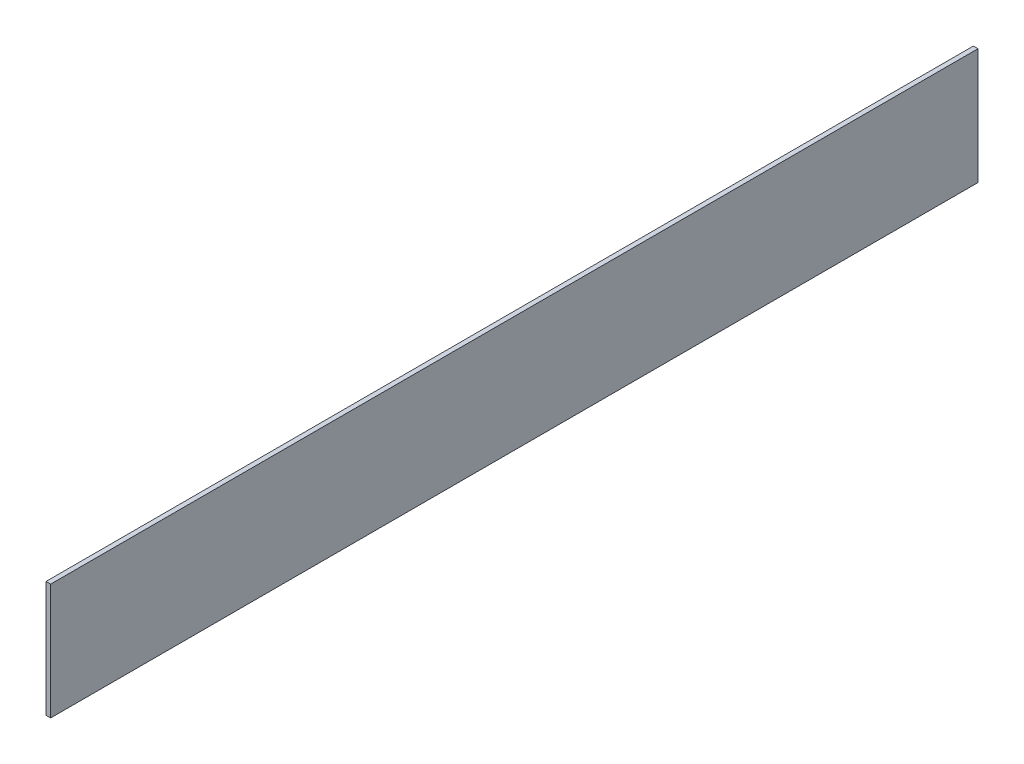
ISO-10303-21;
HEADER;
FILE_DESCRIPTION(('STEP AP214'),'2;1');
FILE_NAME('part.step','',(''),(''),'','','');
FILE_SCHEMA(('AUTOMOTIVE_DESIGN { 1 0 10303 214 1 1 1 1 }'));
ENDSEC;
DATA;
#1=APPLICATION_CONTEXT('core data for automotive mechanical design processes');
#2=APPLICATION_PROTOCOL_DEFINITION('international standard','automotive_design',2000,#1);
#3=PRODUCT_CONTEXT('',#1,'mechanical');
#4=PRODUCT('Part','Part','',(#3));
#5=PRODUCT_RELATED_PRODUCT_CATEGORY('part','',(#4));
#6=PRODUCT_DEFINITION_FORMATION('','',#4);
#7=PRODUCT_DEFINITION_CONTEXT('part definition',#1,'design');
#8=PRODUCT_DEFINITION('design','',#6,#7);
#9=PRODUCT_DEFINITION_SHAPE('','',#8);
#10=(LENGTH_UNIT() NAMED_UNIT(*) SI_UNIT(.MILLI.,.METRE.));
#11=(NAMED_UNIT(*) PLANE_ANGLE_UNIT() SI_UNIT($,.RADIAN.));
#12=(NAMED_UNIT(*) SI_UNIT($,.STERADIAN.) SOLID_ANGLE_UNIT());
#13=UNCERTAINTY_MEASURE_WITH_UNIT(LENGTH_MEASURE(1.E-05),#10,'distance_accuracy_value','');
#14=(GEOMETRIC_REPRESENTATION_CONTEXT(3) GLOBAL_UNCERTAINTY_ASSIGNED_CONTEXT((#13)) GLOBAL_UNIT_ASSIGNED_CONTEXT((#10,
#11,#12)) REPRESENTATION_CONTEXT('',''));
#15=CARTESIAN_POINT('',(0.,0.,0.));
#16=DIRECTION('',(0.,0.,1.));
#17=DIRECTION('',(1.,0.,0.));
#18=AXIS2_PLACEMENT_3D('',#15,#16,#17);
#19=CARTESIAN_POINT('',(318.4,1.6,-320.));
#20=DIRECTION('',(-1.,0.,0.));
#21=DIRECTION('',(0.,0.,1.));
#22=AXIS2_PLACEMENT_3D('',#19,#20,#21);
#23=PLANE('',#22);
#24=DIRECTION('',(0.,-1.,0.));
#25=VECTOR('',#24,1.);
#26=CARTESIAN_POINT('',(318.4,1.6,0.));
#27=LINE('',#26,#25);
#28=CARTESIAN_POINT('',(318.4,41.6,0.));
#29=VERTEX_POINT('',#28);
#30=CARTESIAN_POINT('',(318.4,1.6,0.));
#31=VERTEX_POINT('',#30);
#32=EDGE_CURVE('E103',#29,#31,#27,.T.);
#33=ORIENTED_EDGE('',*,*,#32,.F.);
#34=DIRECTION('',(0.,0.,1.));
#35=VECTOR('',#34,1.);
#36=CARTESIAN_POINT('',(318.4,41.6,-320.));
#37=LINE('',#36,#35);
#38=CARTESIAN_POINT('',(318.4,41.6,-320.));
#39=VERTEX_POINT('',#38);
#40=EDGE_CURVE('E11',#39,#29,#37,.T.);
#41=ORIENTED_EDGE('',*,*,#40,.F.);
#42=DIRECTION('',(0.,-1.,0.));
#43=VECTOR('',#42,1.);
#44=CARTESIAN_POINT('',(318.4,1.6,-320.));
#45=LINE('',#44,#43);
#46=CARTESIAN_POINT('',(318.4,1.6,-320.));
#47=VERTEX_POINT('',#46);
#48=EDGE_CURVE('E97',#39,#47,#45,.T.);
#49=ORIENTED_EDGE('',*,*,#48,.T.);
#50=DIRECTION('',(0.,0.,1.));
#51=VECTOR('',#50,1.);
#52=CARTESIAN_POINT('',(318.4,1.6,-320.));
#53=LINE('',#52,#51);
#54=EDGE_CURVE('E42',#47,#31,#53,.T.);
#55=ORIENTED_EDGE('',*,*,#54,.T.);
#56=EDGE_LOOP('',(#33,#41,#49,#55));
#57=FACE_BOUND('',#56,.T.);
#58=ADVANCED_FACE('F39',(#57),#23,.T.);
#59=CARTESIAN_POINT('',(318.4,41.6,-320.));
#60=DIRECTION('',(0.,1.,0.));
#61=DIRECTION('',(0.,0.,1.));
#62=AXIS2_PLACEMENT_3D('',#59,#60,#61);
#63=PLANE('',#62);
#64=DIRECTION('',(-1.,0.,0.));
#65=VECTOR('',#64,1.);
#66=CARTESIAN_POINT('',(318.4,41.6,0.));
#67=LINE('',#66,#65);
#68=CARTESIAN_POINT('',(320.,41.6,0.));
#69=VERTEX_POINT('',#68);
#70=EDGE_CURVE('E99',#69,#29,#67,.T.);
#71=ORIENTED_EDGE('',*,*,#70,.F.);
#72=DIRECTION('',(0.,0.,1.));
#73=VECTOR('',#72,1.);
#74=CARTESIAN_POINT('',(320.,41.6,-320.));
#75=LINE('',#74,#73);
#76=CARTESIAN_POINT('',(320.,41.6,-320.));
#77=VERTEX_POINT('',#76);
#78=EDGE_CURVE('E48',#77,#69,#75,.T.);
#79=ORIENTED_EDGE('',*,*,#78,.F.);
#80=DIRECTION('',(-1.,0.,0.));
#81=VECTOR('',#80,1.);
#82=CARTESIAN_POINT('',(318.4,41.6,-320.));
#83=LINE('',#82,#81);
#84=EDGE_CURVE('E94',#77,#39,#83,.T.);
#85=ORIENTED_EDGE('',*,*,#84,.T.);
#86=ORIENTED_EDGE('',*,*,#40,.T.);
#87=EDGE_LOOP('',(#71,#79,#85,#86));
#88=FACE_BOUND('',#87,.T.);
#89=ADVANCED_FACE('F113',(#88),#63,.T.);
#90=CARTESIAN_POINT('',(320.,1.6,-320.));
#91=DIRECTION('',(1.,0.,0.));
#92=DIRECTION('',(0.,0.,-1.));
#93=AXIS2_PLACEMENT_3D('',#90,#91,#92);
#94=PLANE('',#93);
#95=DIRECTION('',(0.,1.,0.));
#96=VECTOR('',#95,1.);
#97=CARTESIAN_POINT('',(320.,1.6,0.));
#98=LINE('',#97,#96);
#99=CARTESIAN_POINT('',(320.,1.6,0.));
#100=VERTEX_POINT('',#99);
#101=EDGE_CURVE('E89',#100,#69,#98,.T.);
#102=ORIENTED_EDGE('',*,*,#101,.F.);
#103=DIRECTION('',(0.,0.,1.));
#104=VECTOR('',#103,1.);
#105=CARTESIAN_POINT('',(320.,1.6,-320.));
#106=LINE('',#105,#104);
#107=CARTESIAN_POINT('',(320.,1.6,-320.));
#108=VERTEX_POINT('',#107);
#109=EDGE_CURVE('E84',#108,#100,#106,.T.);
#110=ORIENTED_EDGE('',*,*,#109,.F.);
#111=DIRECTION('',(0.,1.,0.));
#112=VECTOR('',#111,1.);
#113=CARTESIAN_POINT('',(320.,1.6,-320.));
#114=LINE('',#113,#112);
#115=EDGE_CURVE('E87',#108,#77,#114,.T.);
#116=ORIENTED_EDGE('',*,*,#115,.T.);
#117=ORIENTED_EDGE('',*,*,#78,.T.);
#118=EDGE_LOOP('',(#102,#110,#116,#117));
#119=FACE_BOUND('',#118,.T.);
#120=ADVANCED_FACE('F86',(#119),#94,.T.);
#121=CARTESIAN_POINT('',(318.4,1.6,-320.));
#122=DIRECTION('',(0.,-1.,0.));
#123=DIRECTION('',(0.,0.,-1.));
#124=AXIS2_PLACEMENT_3D('',#121,#122,#123);
#125=PLANE('',#124);
#126=DIRECTION('',(1.,0.,0.));
#127=VECTOR('',#126,1.);
#128=CARTESIAN_POINT('',(318.4,1.6,0.));
#129=LINE('',#128,#127);
#130=EDGE_CURVE('E106',#31,#100,#129,.T.);
#131=ORIENTED_EDGE('',*,*,#130,.F.);
#132=ORIENTED_EDGE('',*,*,#54,.F.);
#133=DIRECTION('',(1.,0.,0.));
#134=VECTOR('',#133,1.);
#135=CARTESIAN_POINT('',(318.4,1.6,-320.));
#136=LINE('',#135,#134);
#137=EDGE_CURVE('E93',#47,#108,#136,.T.);
#138=ORIENTED_EDGE('',*,*,#137,.T.);
#139=ORIENTED_EDGE('',*,*,#109,.T.);
#140=EDGE_LOOP('',(#131,#132,#138,#139));
#141=FACE_BOUND('',#140,.T.);
#142=ADVANCED_FACE('F96',(#141),#125,.T.);
#143=CARTESIAN_POINT('',(0.,0.,-320.));
#144=DIRECTION('',(0.,0.,-1.));
#145=DIRECTION('',(-1.,0.,0.));
#146=AXIS2_PLACEMENT_3D('',#143,#144,#145);
#147=PLANE('',#146);
#148=ORIENTED_EDGE('',*,*,#48,.F.);
#149=ORIENTED_EDGE('',*,*,#84,.F.);
#150=ORIENTED_EDGE('',*,*,#115,.F.);
#151=ORIENTED_EDGE('',*,*,#137,.F.);
#152=EDGE_LOOP('',(#148,#149,#150,#151));
#153=FACE_BOUND('',#152,.T.);
#154=ADVANCED_FACE('F92',(#153),#147,.T.);
#155=CARTESIAN_POINT('',(0.,0.,0.));
#156=DIRECTION('',(0.,0.,-1.));
#157=DIRECTION('',(-1.,0.,0.));
#158=AXIS2_PLACEMENT_3D('',#155,#156,#157);
#159=PLANE('',#158);
#160=ORIENTED_EDGE('',*,*,#32,.T.);
#161=ORIENTED_EDGE('',*,*,#130,.T.);
#162=ORIENTED_EDGE('',*,*,#101,.T.);
#163=ORIENTED_EDGE('',*,*,#70,.T.);
#164=EDGE_LOOP('',(#160,#161,#162,#163));
#165=FACE_BOUND('',#164,.T.);
#166=ADVANCED_FACE('F112',(#165),#159,.F.);
#167=CLOSED_SHELL('',(#58,#89,#120,#142,#154,#166));
#168=MANIFOLD_SOLID_BREP('B2',#167);
#169=ADVANCED_BREP_SHAPE_REPRESENTATION('',(#18,#168),#14);
#170=SHAPE_DEFINITION_REPRESENTATION(#9,#169);
ENDSEC;
END-ISO-10303-21;
